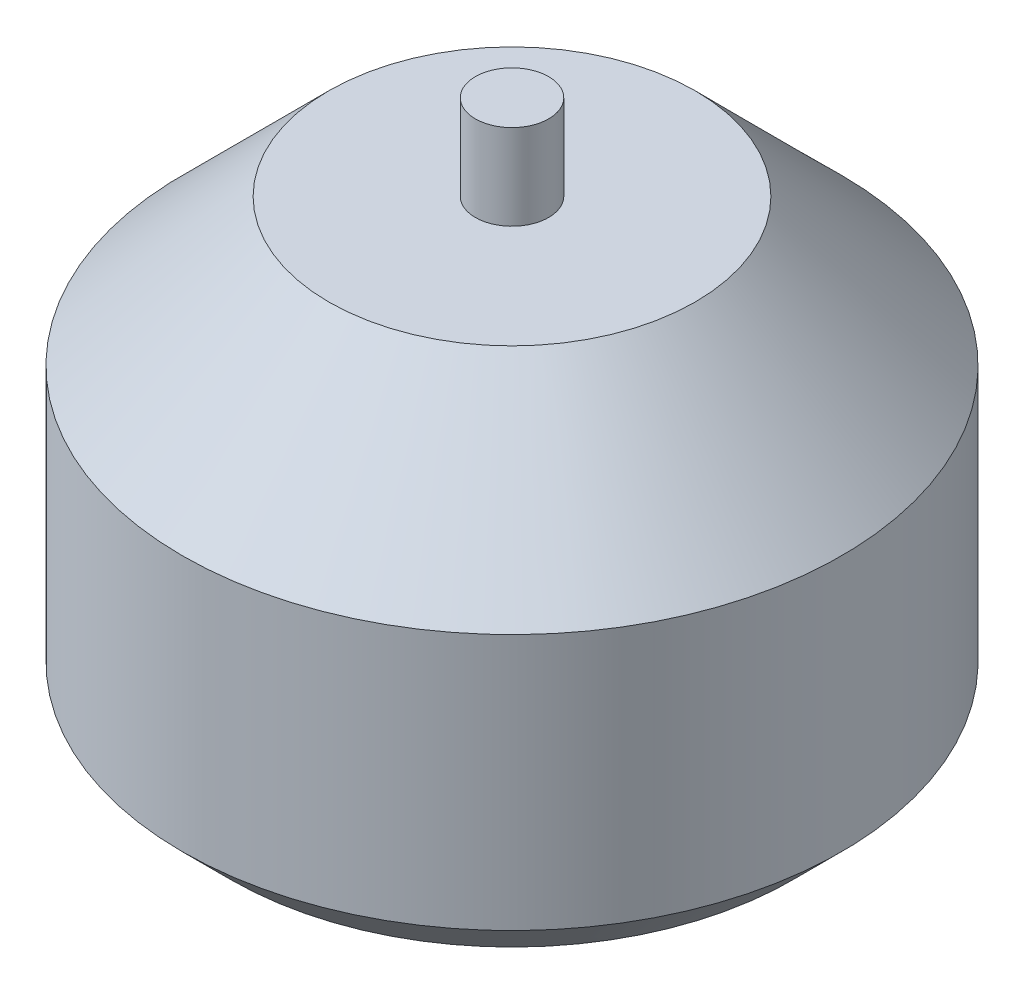
ISO-10303-21;
HEADER;
FILE_DESCRIPTION(('STEP AP214'),'2;1');
FILE_NAME('part.step','',(''),(''),'','','');
FILE_SCHEMA(('AUTOMOTIVE_DESIGN { 1 0 10303 214 1 1 1 1 }'));
ENDSEC;
DATA;
#1=APPLICATION_CONTEXT('core data for automotive mechanical design processes');
#2=APPLICATION_PROTOCOL_DEFINITION('international standard','automotive_design',2000,#1);
#3=PRODUCT_CONTEXT('',#1,'mechanical');
#4=PRODUCT('Part','Part','',(#3));
#5=PRODUCT_RELATED_PRODUCT_CATEGORY('part','',(#4));
#6=PRODUCT_DEFINITION_FORMATION('','',#4);
#7=PRODUCT_DEFINITION_CONTEXT('part definition',#1,'design');
#8=PRODUCT_DEFINITION('design','',#6,#7);
#9=PRODUCT_DEFINITION_SHAPE('','',#8);
#10=(LENGTH_UNIT() NAMED_UNIT(*) SI_UNIT(.MILLI.,.METRE.));
#11=(NAMED_UNIT(*) PLANE_ANGLE_UNIT() SI_UNIT($,.RADIAN.));
#12=(NAMED_UNIT(*) SI_UNIT($,.STERADIAN.) SOLID_ANGLE_UNIT());
#13=UNCERTAINTY_MEASURE_WITH_UNIT(LENGTH_MEASURE(1.E-05),#10,'distance_accuracy_value','');
#14=(GEOMETRIC_REPRESENTATION_CONTEXT(3) GLOBAL_UNCERTAINTY_ASSIGNED_CONTEXT((#13)) GLOBAL_UNIT_ASSIGNED_CONTEXT((#10,
#11,#12)) REPRESENTATION_CONTEXT('',''));
#15=CARTESIAN_POINT('',(0.,0.,0.));
#16=DIRECTION('',(0.,0.,1.));
#17=DIRECTION('',(1.,0.,0.));
#18=AXIS2_PLACEMENT_3D('',#15,#16,#17);
#19=CARTESIAN_POINT('',(0.,18.5,0.));
#20=DIRECTION('',(0.,-1.,0.));
#21=DIRECTION('',(0.,0.,-1.));
#22=AXIS2_PLACEMENT_3D('',#19,#20,#21);
#23=CYLINDRICAL_SURFACE('',#22,13.5);
#24=CARTESIAN_POINT('',(0.,2.00000000000001,0.));
#25=DIRECTION('',(0.,1.,0.));
#26=DIRECTION('',(0.,0.,1.));
#27=AXIS2_PLACEMENT_3D('',#24,#25,#26);
#28=CIRCLE('',#27,13.5);
#29=CARTESIAN_POINT('',(0.,2.00000000000001,13.5));
#30=VERTEX_POINT('',#29);
#31=EDGE_CURVE('E38',#30,#30,#28,.T.);
#32=ORIENTED_EDGE('',*,*,#31,.T.);
#33=EDGE_LOOP('',(#32));
#34=FACE_BOUND('',#33,.T.);
#35=CARTESIAN_POINT('',(0.,12.5,0.));
#36=DIRECTION('',(0.,1.,0.));
#37=DIRECTION('',(0.,0.,1.));
#38=AXIS2_PLACEMENT_3D('',#35,#36,#37);
#39=CIRCLE('',#38,13.5);
#40=CARTESIAN_POINT('',(0.,12.5,13.5));
#41=VERTEX_POINT('',#40);
#42=EDGE_CURVE('E42',#41,#41,#39,.F.);
#43=ORIENTED_EDGE('',*,*,#42,.T.);
#44=EDGE_LOOP('',(#43));
#45=FACE_BOUND('',#44,.T.);
#46=ADVANCED_FACE('F31',(#34,#45),#23,.T.);
#47=CARTESIAN_POINT('',(0.,18.5,0.));
#48=DIRECTION('',(0.,1.,0.));
#49=DIRECTION('',(0.,0.,1.));
#50=AXIS2_PLACEMENT_3D('',#47,#48,#49);
#51=PLANE('',#50);
#52=CARTESIAN_POINT('',(0.,18.5,0.));
#53=DIRECTION('',(0.,1.,0.));
#54=DIRECTION('',(0.,0.,1.));
#55=AXIS2_PLACEMENT_3D('',#52,#53,#54);
#56=CIRCLE('',#55,7.5);
#57=CARTESIAN_POINT('',(0.,18.5,7.5));
#58=VERTEX_POINT('',#57);
#59=EDGE_CURVE('E46',#58,#58,#56,.T.);
#60=ORIENTED_EDGE('',*,*,#59,.T.);
#61=EDGE_LOOP('',(#60));
#62=FACE_BOUND('',#61,.T.);
#63=CARTESIAN_POINT('',(0.,18.5,0.));
#64=DIRECTION('',(0.,1.,0.));
#65=DIRECTION('',(0.,0.,1.));
#66=AXIS2_PLACEMENT_3D('',#63,#64,#65);
#67=CIRCLE('',#66,1.5);
#68=CARTESIAN_POINT('',(0.,18.5,1.5));
#69=VERTEX_POINT('',#68);
#70=EDGE_CURVE('E55',#69,#69,#67,.T.);
#71=ORIENTED_EDGE('',*,*,#70,.F.);
#72=EDGE_LOOP('',(#71));
#73=FACE_BOUND('',#72,.T.);
#74=ADVANCED_FACE('F76',(#62,#73),#51,.T.);
#75=CARTESIAN_POINT('',(0.,0.,0.));
#76=DIRECTION('',(0.,1.,0.));
#77=DIRECTION('',(0.,0.,1.));
#78=AXIS2_PLACEMENT_3D('',#75,#76,#77);
#79=PLANE('',#78);
#80=CARTESIAN_POINT('',(0.,0.,0.));
#81=DIRECTION('',(0.,1.,0.));
#82=DIRECTION('',(0.,0.,1.));
#83=AXIS2_PLACEMENT_3D('',#80,#81,#82);
#84=CIRCLE('',#83,11.5);
#85=CARTESIAN_POINT('',(0.,0.,11.5));
#86=VERTEX_POINT('',#85);
#87=EDGE_CURVE('E10',#86,#86,#84,.F.);
#88=ORIENTED_EDGE('',*,*,#87,.T.);
#89=EDGE_LOOP('',(#88));
#90=FACE_BOUND('',#89,.T.);
#91=CARTESIAN_POINT('',(0.,0.,0.));
#92=DIRECTION('',(0.,1.,0.));
#93=DIRECTION('',(0.,0.,1.));
#94=AXIS2_PLACEMENT_3D('',#91,#92,#93);
#95=CIRCLE('',#94,1.5);
#96=CARTESIAN_POINT('',(0.,0.,1.5));
#97=VERTEX_POINT('',#96);
#98=EDGE_CURVE('E51',#97,#97,#95,.F.);
#99=ORIENTED_EDGE('',*,*,#98,.F.);
#100=EDGE_LOOP('',(#99));
#101=FACE_BOUND('',#100,.T.);
#102=ADVANCED_FACE('F73',(#90,#101),#79,.F.);
#103=CARTESIAN_POINT('',(0.,22.,0.));
#104=DIRECTION('',(0.,-1.,0.));
#105=DIRECTION('',(0.,0.,-1.));
#106=AXIS2_PLACEMENT_3D('',#103,#104,#105);
#107=CYLINDRICAL_SURFACE('',#106,1.5);
#108=CARTESIAN_POINT('',(0.,22.,0.));
#109=DIRECTION('',(0.,1.,0.));
#110=DIRECTION('',(0.,0.,1.));
#111=AXIS2_PLACEMENT_3D('',#108,#109,#110);
#112=CIRCLE('',#111,1.5);
#113=CARTESIAN_POINT('',(0.,22.,1.5));
#114=VERTEX_POINT('',#113);
#115=EDGE_CURVE('E54',#114,#114,#112,.T.);
#116=ORIENTED_EDGE('',*,*,#115,.F.);
#117=EDGE_LOOP('',(#116));
#118=FACE_BOUND('',#117,.T.);
#119=ORIENTED_EDGE('',*,*,#70,.T.);
#120=EDGE_LOOP('',(#119));
#121=FACE_BOUND('',#120,.T.);
#122=ADVANCED_FACE('F75',(#118,#121),#107,.T.);
#123=CARTESIAN_POINT('',(0.,22.,0.));
#124=DIRECTION('',(0.,1.,0.));
#125=DIRECTION('',(0.,0.,1.));
#126=AXIS2_PLACEMENT_3D('',#123,#124,#125);
#127=PLANE('',#126);
#128=ORIENTED_EDGE('',*,*,#115,.T.);
#129=EDGE_LOOP('',(#128));
#130=FACE_BOUND('',#129,.T.);
#131=ADVANCED_FACE('F69',(#130),#127,.T.);
#132=CARTESIAN_POINT('',(0.,-3.,0.));
#133=DIRECTION('',(0.,1.,0.));
#134=DIRECTION('',(0.,0.,1.));
#135=AXIS2_PLACEMENT_3D('',#132,#133,#134);
#136=CYLINDRICAL_SURFACE('',#135,1.5);
#137=CARTESIAN_POINT('',(0.,-3.,0.));
#138=DIRECTION('',(0.,-1.,0.));
#139=DIRECTION('',(0.,0.,-1.));
#140=AXIS2_PLACEMENT_3D('',#137,#138,#139);
#141=CIRCLE('',#140,1.5);
#142=CARTESIAN_POINT('',(0.,-3.,-1.5));
#143=VERTEX_POINT('',#142);
#144=EDGE_CURVE('E58',#143,#143,#141,.T.);
#145=ORIENTED_EDGE('',*,*,#144,.F.);
#146=EDGE_LOOP('',(#145));
#147=FACE_BOUND('',#146,.T.);
#148=ORIENTED_EDGE('',*,*,#98,.T.);
#149=EDGE_LOOP('',(#148));
#150=FACE_BOUND('',#149,.T.);
#151=ADVANCED_FACE('F66',(#147,#150),#136,.T.);
#152=CARTESIAN_POINT('',(0.,-3.,0.));
#153=DIRECTION('',(0.,-1.,0.));
#154=DIRECTION('',(0.,0.,-1.));
#155=AXIS2_PLACEMENT_3D('',#152,#153,#154);
#156=PLANE('',#155);
#157=ORIENTED_EDGE('',*,*,#144,.T.);
#158=EDGE_LOOP('',(#157));
#159=FACE_BOUND('',#158,.T.);
#160=ADVANCED_FACE('F64',(#159),#156,.T.);
#161=CARTESIAN_POINT('',(0.,18.5,0.));
#162=DIRECTION('',(0.,-1.,0.));
#163=DIRECTION('',(0.,0.,-1.));
#164=AXIS2_PLACEMENT_3D('',#161,#162,#163);
#165=CONICAL_SURFACE('',#164,7.5,0.785398163397447);
#166=ORIENTED_EDGE('',*,*,#42,.F.);
#167=EDGE_LOOP('',(#166));
#168=FACE_BOUND('',#167,.T.);
#169=ORIENTED_EDGE('',*,*,#59,.F.);
#170=EDGE_LOOP('',(#169));
#171=FACE_BOUND('',#170,.T.);
#172=ADVANCED_FACE('F91',(#168,#171),#165,.T.);
#173=CARTESIAN_POINT('',(0.,2.00000000000001,0.));
#174=DIRECTION('',(0.,1.,0.));
#175=DIRECTION('',(0.,0.,1.));
#176=AXIS2_PLACEMENT_3D('',#173,#174,#175);
#177=CONICAL_SURFACE('',#176,13.5,0.785398163397449);
#178=ORIENTED_EDGE('',*,*,#87,.F.);
#179=EDGE_LOOP('',(#178));
#180=FACE_BOUND('',#179,.T.);
#181=ORIENTED_EDGE('',*,*,#31,.F.);
#182=EDGE_LOOP('',(#181));
#183=FACE_BOUND('',#182,.T.);
#184=ADVANCED_FACE('F33',(#180,#183),#177,.T.);
#185=CLOSED_SHELL('',(#46,#74,#102,#122,#131,#151,#160,#172,#184));
#186=MANIFOLD_SOLID_BREP('B2',#185);
#187=ADVANCED_BREP_SHAPE_REPRESENTATION('',(#18,#186),#14);
#188=SHAPE_DEFINITION_REPRESENTATION(#9,#187);
ENDSEC;
END-ISO-10303-21;
